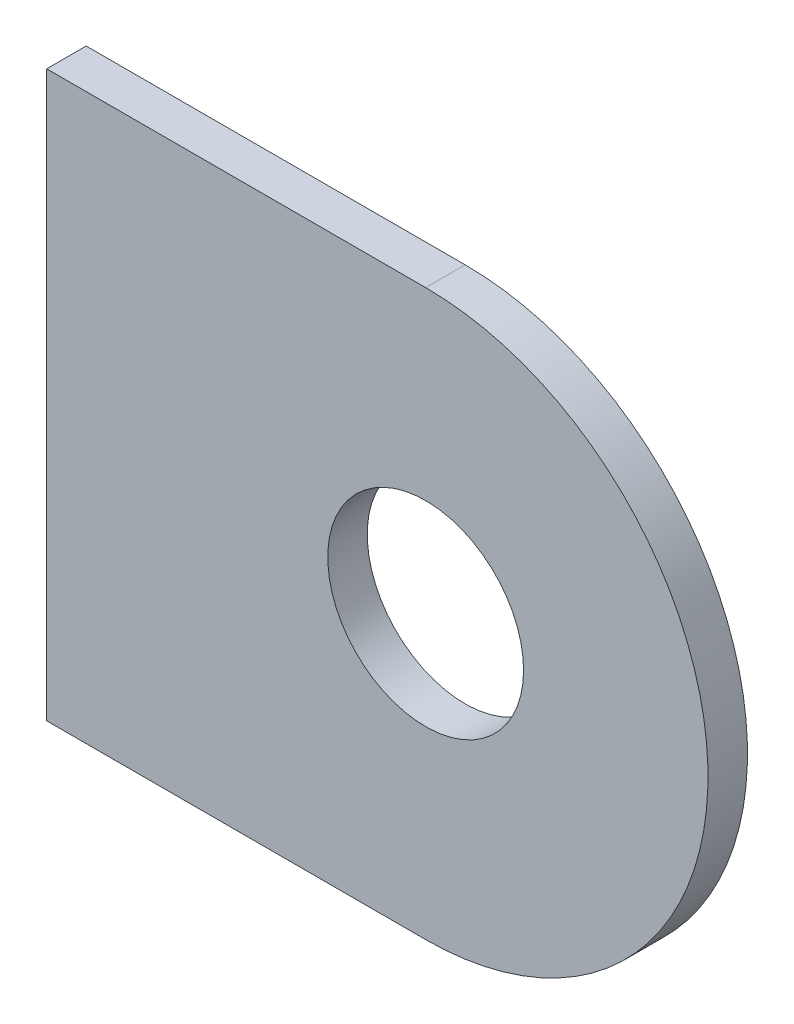
ISO-10303-21;
HEADER;
FILE_DESCRIPTION(('STEP AP214'),'2;1');
FILE_NAME('part.step','',(''),(''),'','','');
FILE_SCHEMA(('AUTOMOTIVE_DESIGN { 1 0 10303 214 1 1 1 1 }'));
ENDSEC;
DATA;
#1=APPLICATION_CONTEXT('core data for automotive mechanical design processes');
#2=APPLICATION_PROTOCOL_DEFINITION('international standard','automotive_design',2000,#1);
#3=PRODUCT_CONTEXT('',#1,'mechanical');
#4=PRODUCT('Part','Part','',(#3));
#5=PRODUCT_RELATED_PRODUCT_CATEGORY('part','',(#4));
#6=PRODUCT_DEFINITION_FORMATION('','',#4);
#7=PRODUCT_DEFINITION_CONTEXT('part definition',#1,'design');
#8=PRODUCT_DEFINITION('design','',#6,#7);
#9=PRODUCT_DEFINITION_SHAPE('','',#8);
#10=(LENGTH_UNIT() NAMED_UNIT(*) SI_UNIT(.MILLI.,.METRE.));
#11=(NAMED_UNIT(*) PLANE_ANGLE_UNIT() SI_UNIT($,.RADIAN.));
#12=(NAMED_UNIT(*) SI_UNIT($,.STERADIAN.) SOLID_ANGLE_UNIT());
#13=UNCERTAINTY_MEASURE_WITH_UNIT(LENGTH_MEASURE(1.E-05),#10,'distance_accuracy_value','');
#14=(GEOMETRIC_REPRESENTATION_CONTEXT(3) GLOBAL_UNCERTAINTY_ASSIGNED_CONTEXT((#13)) GLOBAL_UNIT_ASSIGNED_CONTEXT((#10,
#11,#12)) REPRESENTATION_CONTEXT('',''));
#15=CARTESIAN_POINT('',(0.,0.,0.));
#16=DIRECTION('',(0.,0.,1.));
#17=DIRECTION('',(1.,0.,0.));
#18=AXIS2_PLACEMENT_3D('',#15,#16,#17);
#19=CARTESIAN_POINT('',(15.24,11.3538,1.5875));
#20=DIRECTION('',(0.,0.,1.));
#21=DIRECTION('',(1.,0.,0.));
#22=AXIS2_PLACEMENT_3D('',#19,#20,#21);
#23=PLANE('',#22);
#24=DIRECTION('',(0.,-1.,0.));
#25=VECTOR('',#24,1.);
#26=CARTESIAN_POINT('',(0.,0.,1.5875));
#27=LINE('',#26,#25);
#28=CARTESIAN_POINT('',(0.,22.7076,1.5875));
#29=VERTEX_POINT('',#28);
#30=CARTESIAN_POINT('',(0.,0.,1.5875));
#31=VERTEX_POINT('',#30);
#32=EDGE_CURVE('E85',#29,#31,#27,.T.);
#33=ORIENTED_EDGE('',*,*,#32,.T.);
#34=DIRECTION('',(1.,0.,0.));
#35=VECTOR('',#34,1.);
#36=CARTESIAN_POINT('',(0.,0.,1.5875));
#37=LINE('',#36,#35);
#38=CARTESIAN_POINT('',(15.24,0.,1.5875));
#39=VERTEX_POINT('',#38);
#40=EDGE_CURVE('E80',#31,#39,#37,.T.);
#41=ORIENTED_EDGE('',*,*,#40,.T.);
#42=CARTESIAN_POINT('',(15.24,11.3538,1.5875));
#43=DIRECTION('',(0.,0.,1.));
#44=DIRECTION('',(1.,0.,0.));
#45=AXIS2_PLACEMENT_3D('',#42,#43,#44);
#46=CIRCLE('',#45,11.3538);
#47=CARTESIAN_POINT('',(15.24,22.7076,1.5875));
#48=VERTEX_POINT('',#47);
#49=EDGE_CURVE('E83',#39,#48,#46,.T.);
#50=ORIENTED_EDGE('',*,*,#49,.T.);
#51=DIRECTION('',(-1.,0.,0.));
#52=VECTOR('',#51,1.);
#53=CARTESIAN_POINT('',(0.,22.7076,1.5875));
#54=LINE('',#53,#52);
#55=EDGE_CURVE('E50',#48,#29,#54,.T.);
#56=ORIENTED_EDGE('',*,*,#55,.T.);
#57=EDGE_LOOP('',(#33,#41,#50,#56));
#58=FACE_BOUND('',#57,.T.);
#59=CARTESIAN_POINT('',(15.24,11.3538,1.5875));
#60=DIRECTION('',(0.,0.,1.));
#61=DIRECTION('',(1.,0.,0.));
#62=AXIS2_PLACEMENT_3D('',#59,#60,#61);
#63=CIRCLE('',#62,3.937);
#64=CARTESIAN_POINT('',(19.177,11.3538,1.5875));
#65=VERTEX_POINT('',#64);
#66=EDGE_CURVE('E100',#65,#65,#63,.T.);
#67=ORIENTED_EDGE('',*,*,#66,.F.);
#68=EDGE_LOOP('',(#67));
#69=FACE_BOUND('',#68,.T.);
#70=ADVANCED_FACE('F33',(#58,#69),#23,.T.);
#71=CARTESIAN_POINT('',(15.24,11.3538,0.));
#72=DIRECTION('',(0.,0.,1.));
#73=DIRECTION('',(1.,0.,0.));
#74=AXIS2_PLACEMENT_3D('',#71,#72,#73);
#75=PLANE('',#74);
#76=DIRECTION('',(0.,-1.,0.));
#77=VECTOR('',#76,1.);
#78=CARTESIAN_POINT('',(0.,0.,0.));
#79=LINE('',#78,#77);
#80=CARTESIAN_POINT('',(0.,22.7076,0.));
#81=VERTEX_POINT('',#80);
#82=CARTESIAN_POINT('',(0.,0.,0.));
#83=VERTEX_POINT('',#82);
#84=EDGE_CURVE('E97',#81,#83,#79,.T.);
#85=ORIENTED_EDGE('',*,*,#84,.F.);
#86=DIRECTION('',(-1.,0.,0.));
#87=VECTOR('',#86,1.);
#88=CARTESIAN_POINT('',(0.,22.7076,0.));
#89=LINE('',#88,#87);
#90=CARTESIAN_POINT('',(15.24,22.7076,0.));
#91=VERTEX_POINT('',#90);
#92=EDGE_CURVE('E73',#91,#81,#89,.T.);
#93=ORIENTED_EDGE('',*,*,#92,.F.);
#94=CARTESIAN_POINT('',(15.24,11.3538,0.));
#95=DIRECTION('',(0.,0.,1.));
#96=DIRECTION('',(1.,0.,0.));
#97=AXIS2_PLACEMENT_3D('',#94,#95,#96);
#98=CIRCLE('',#97,11.3538);
#99=CARTESIAN_POINT('',(15.24,0.,0.));
#100=VERTEX_POINT('',#99);
#101=EDGE_CURVE('E67',#100,#91,#98,.T.);
#102=ORIENTED_EDGE('',*,*,#101,.F.);
#103=DIRECTION('',(1.,0.,0.));
#104=VECTOR('',#103,1.);
#105=CARTESIAN_POINT('',(0.,0.,0.));
#106=LINE('',#105,#104);
#107=EDGE_CURVE('E89',#83,#100,#106,.T.);
#108=ORIENTED_EDGE('',*,*,#107,.F.);
#109=EDGE_LOOP('',(#85,#93,#102,#108));
#110=FACE_BOUND('',#109,.T.);
#111=CARTESIAN_POINT('',(15.24,11.3538,0.));
#112=DIRECTION('',(0.,0.,1.));
#113=DIRECTION('',(1.,0.,0.));
#114=AXIS2_PLACEMENT_3D('',#111,#112,#113);
#115=CIRCLE('',#114,3.937);
#116=CARTESIAN_POINT('',(19.177,11.3538,0.));
#117=VERTEX_POINT('',#116);
#118=EDGE_CURVE('E112',#117,#117,#115,.T.);
#119=ORIENTED_EDGE('',*,*,#118,.T.);
#120=EDGE_LOOP('',(#119));
#121=FACE_BOUND('',#120,.T.);
#122=ADVANCED_FACE('F108',(#110,#121),#75,.F.);
#123=CARTESIAN_POINT('',(0.,0.,1.5875));
#124=DIRECTION('',(1.,0.,0.));
#125=DIRECTION('',(0.,1.,0.));
#126=AXIS2_PLACEMENT_3D('',#123,#124,#125);
#127=PLANE('',#126);
#128=ORIENTED_EDGE('',*,*,#84,.T.);
#129=DIRECTION('',(0.,0.,-1.));
#130=VECTOR('',#129,1.);
#131=CARTESIAN_POINT('',(0.,0.,1.5875));
#132=LINE('',#131,#130);
#133=EDGE_CURVE('E11',#31,#83,#132,.T.);
#134=ORIENTED_EDGE('',*,*,#133,.F.);
#135=ORIENTED_EDGE('',*,*,#32,.F.);
#136=DIRECTION('',(0.,0.,-1.));
#137=VECTOR('',#136,1.);
#138=CARTESIAN_POINT('',(0.,22.7076,1.5875));
#139=LINE('',#138,#137);
#140=EDGE_CURVE('E93',#29,#81,#139,.T.);
#141=ORIENTED_EDGE('',*,*,#140,.T.);
#142=EDGE_LOOP('',(#128,#134,#135,#141));
#143=FACE_BOUND('',#142,.T.);
#144=ADVANCED_FACE('F35',(#143),#127,.F.);
#145=CARTESIAN_POINT('',(0.,0.,1.5875));
#146=DIRECTION('',(0.,1.,0.));
#147=DIRECTION('',(0.,0.,1.));
#148=AXIS2_PLACEMENT_3D('',#145,#146,#147);
#149=PLANE('',#148);
#150=ORIENTED_EDGE('',*,*,#107,.T.);
#151=DIRECTION('',(0.,0.,-1.));
#152=VECTOR('',#151,1.);
#153=CARTESIAN_POINT('',(15.24,0.,1.5875));
#154=LINE('',#153,#152);
#155=EDGE_CURVE('E42',#39,#100,#154,.T.);
#156=ORIENTED_EDGE('',*,*,#155,.F.);
#157=ORIENTED_EDGE('',*,*,#40,.F.);
#158=ORIENTED_EDGE('',*,*,#133,.T.);
#159=EDGE_LOOP('',(#150,#156,#157,#158));
#160=FACE_BOUND('',#159,.T.);
#161=ADVANCED_FACE('F88',(#160),#149,.F.);
#162=CARTESIAN_POINT('',(15.24,11.3538,1.5875));
#163=DIRECTION('',(0.,0.,-1.));
#164=DIRECTION('',(-1.,0.,0.));
#165=AXIS2_PLACEMENT_3D('',#162,#163,#164);
#166=CYLINDRICAL_SURFACE('',#165,11.3538);
#167=ORIENTED_EDGE('',*,*,#101,.T.);
#168=DIRECTION('',(0.,0.,-1.));
#169=VECTOR('',#168,1.);
#170=CARTESIAN_POINT('',(15.24,22.7076,1.5875));
#171=LINE('',#170,#169);
#172=EDGE_CURVE('E90',#48,#91,#171,.T.);
#173=ORIENTED_EDGE('',*,*,#172,.F.);
#174=ORIENTED_EDGE('',*,*,#49,.F.);
#175=ORIENTED_EDGE('',*,*,#155,.T.);
#176=EDGE_LOOP('',(#167,#173,#174,#175));
#177=FACE_BOUND('',#176,.T.);
#178=ADVANCED_FACE('F91',(#177),#166,.T.);
#179=CARTESIAN_POINT('',(0.,22.7076,1.5875));
#180=DIRECTION('',(0.,-1.,0.));
#181=DIRECTION('',(0.,0.,-1.));
#182=AXIS2_PLACEMENT_3D('',#179,#180,#181);
#183=PLANE('',#182);
#184=ORIENTED_EDGE('',*,*,#92,.T.);
#185=ORIENTED_EDGE('',*,*,#140,.F.);
#186=ORIENTED_EDGE('',*,*,#55,.F.);
#187=ORIENTED_EDGE('',*,*,#172,.T.);
#188=EDGE_LOOP('',(#184,#185,#186,#187));
#189=FACE_BOUND('',#188,.T.);
#190=ADVANCED_FACE('F105',(#189),#183,.F.);
#191=CARTESIAN_POINT('',(15.24,11.3538,1.5875));
#192=DIRECTION('',(0.,0.,-1.));
#193=DIRECTION('',(-1.,0.,0.));
#194=AXIS2_PLACEMENT_3D('',#191,#192,#193);
#195=CYLINDRICAL_SURFACE('',#194,3.937);
#196=ORIENTED_EDGE('',*,*,#66,.T.);
#197=EDGE_LOOP('',(#196));
#198=FACE_BOUND('',#197,.T.);
#199=ORIENTED_EDGE('',*,*,#118,.F.);
#200=EDGE_LOOP('',(#199));
#201=FACE_BOUND('',#200,.T.);
#202=ADVANCED_FACE('F118',(#198,#201),#195,.F.);
#203=CLOSED_SHELL('',(#70,#122,#144,#161,#178,#190,#202));
#204=MANIFOLD_SOLID_BREP('B2',#203);
#205=ADVANCED_BREP_SHAPE_REPRESENTATION('',(#18,#204),#14);
#206=SHAPE_DEFINITION_REPRESENTATION(#9,#205);
ENDSEC;
END-ISO-10303-21;
